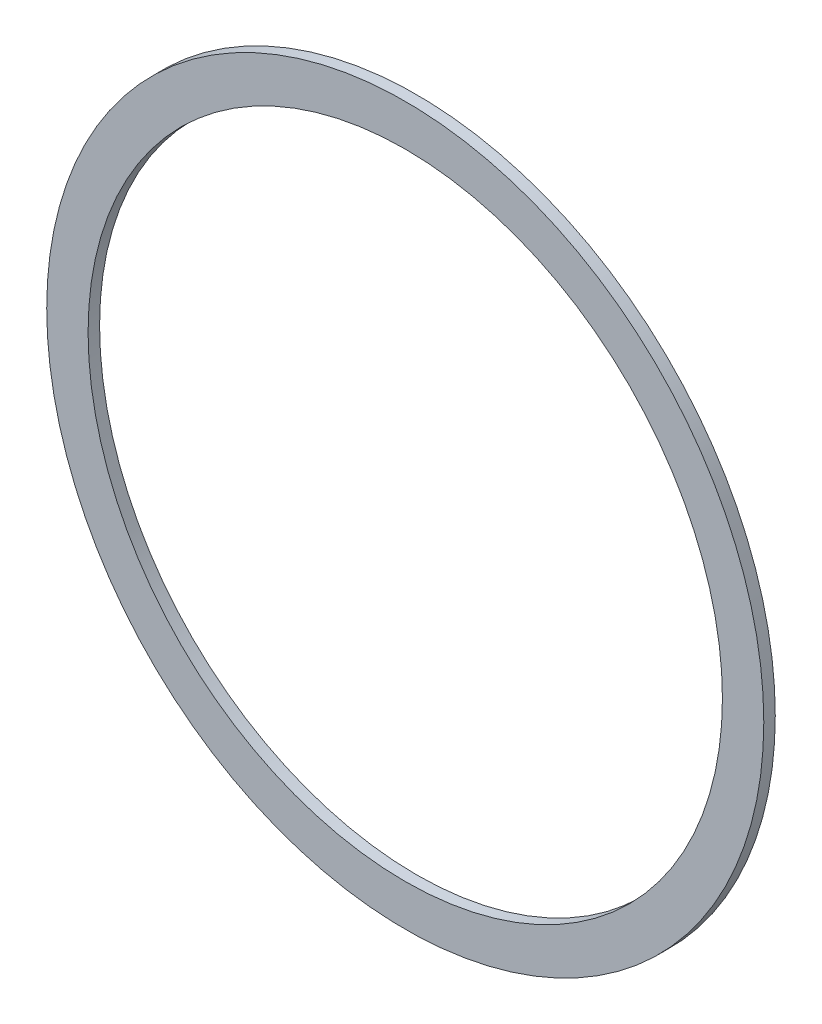
ISO-10303-21;
HEADER;
FILE_DESCRIPTION(('STEP AP214'),'2;1');
FILE_NAME('part.step','',(''),(''),'','','');
FILE_SCHEMA(('AUTOMOTIVE_DESIGN { 1 0 10303 214 1 1 1 1 }'));
ENDSEC;
DATA;
#1=APPLICATION_CONTEXT('core data for automotive mechanical design processes');
#2=APPLICATION_PROTOCOL_DEFINITION('international standard','automotive_design',2000,#1);
#3=PRODUCT_CONTEXT('',#1,'mechanical');
#4=PRODUCT('Part','Part','',(#3));
#5=PRODUCT_RELATED_PRODUCT_CATEGORY('part','',(#4));
#6=PRODUCT_DEFINITION_FORMATION('','',#4);
#7=PRODUCT_DEFINITION_CONTEXT('part definition',#1,'design');
#8=PRODUCT_DEFINITION('design','',#6,#7);
#9=PRODUCT_DEFINITION_SHAPE('','',#8);
#10=(LENGTH_UNIT() NAMED_UNIT(*) SI_UNIT(.MILLI.,.METRE.));
#11=(NAMED_UNIT(*) PLANE_ANGLE_UNIT() SI_UNIT($,.RADIAN.));
#12=(NAMED_UNIT(*) SI_UNIT($,.STERADIAN.) SOLID_ANGLE_UNIT());
#13=UNCERTAINTY_MEASURE_WITH_UNIT(LENGTH_MEASURE(1.E-05),#10,'distance_accuracy_value','');
#14=(GEOMETRIC_REPRESENTATION_CONTEXT(3) GLOBAL_UNCERTAINTY_ASSIGNED_CONTEXT((#13)) GLOBAL_UNIT_ASSIGNED_CONTEXT((#10,
#11,#12)) REPRESENTATION_CONTEXT('',''));
#15=CARTESIAN_POINT('',(0.,0.,0.));
#16=DIRECTION('',(0.,0.,1.));
#17=DIRECTION('',(1.,0.,0.));
#18=AXIS2_PLACEMENT_3D('',#15,#16,#17);
#19=CARTESIAN_POINT('',(0.,0.,0.5));
#20=DIRECTION('',(0.,0.,1.));
#21=DIRECTION('',(1.,0.,0.));
#22=AXIS2_PLACEMENT_3D('',#19,#20,#21);
#23=PLANE('',#22);
#24=CARTESIAN_POINT('',(0.,0.,0.5));
#25=DIRECTION('',(0.,0.,1.));
#26=DIRECTION('',(1.,0.,0.));
#27=AXIS2_PLACEMENT_3D('',#24,#25,#26);
#28=CIRCLE('',#27,15.6);
#29=CARTESIAN_POINT('',(15.6,0.,0.5));
#30=VERTEX_POINT('',#29);
#31=EDGE_CURVE('E11',#30,#30,#28,.T.);
#32=ORIENTED_EDGE('',*,*,#31,.T.);
#33=EDGE_LOOP('',(#32));
#34=FACE_BOUND('',#33,.T.);
#35=CARTESIAN_POINT('',(0.,0.,0.5));
#36=DIRECTION('',(0.,0.,1.));
#37=DIRECTION('',(1.,0.,0.));
#38=AXIS2_PLACEMENT_3D('',#35,#36,#37);
#39=CIRCLE('',#38,13.8);
#40=CARTESIAN_POINT('',(13.8,0.,0.5));
#41=VERTEX_POINT('',#40);
#42=EDGE_CURVE('E54',#41,#41,#39,.T.);
#43=ORIENTED_EDGE('',*,*,#42,.F.);
#44=EDGE_LOOP('',(#43));
#45=FACE_BOUND('',#44,.T.);
#46=ADVANCED_FACE('F43',(#34,#45),#23,.T.);
#47=CARTESIAN_POINT('',(0.,0.,0.));
#48=DIRECTION('',(0.,0.,1.));
#49=DIRECTION('',(1.,0.,0.));
#50=AXIS2_PLACEMENT_3D('',#47,#48,#49);
#51=PLANE('',#50);
#52=CARTESIAN_POINT('',(0.,0.,0.));
#53=DIRECTION('',(0.,0.,1.));
#54=DIRECTION('',(1.,0.,0.));
#55=AXIS2_PLACEMENT_3D('',#52,#53,#54);
#56=CIRCLE('',#55,15.6);
#57=CARTESIAN_POINT('',(15.6,0.,0.));
#58=VERTEX_POINT('',#57);
#59=EDGE_CURVE('E47',#58,#58,#56,.T.);
#60=ORIENTED_EDGE('',*,*,#59,.F.);
#61=EDGE_LOOP('',(#60));
#62=FACE_BOUND('',#61,.T.);
#63=CARTESIAN_POINT('',(0.,0.,0.));
#64=DIRECTION('',(0.,0.,1.));
#65=DIRECTION('',(1.,0.,0.));
#66=AXIS2_PLACEMENT_3D('',#63,#64,#65);
#67=CIRCLE('',#66,13.8);
#68=CARTESIAN_POINT('',(13.8,0.,0.));
#69=VERTEX_POINT('',#68);
#70=EDGE_CURVE('E56',#69,#69,#67,.T.);
#71=ORIENTED_EDGE('',*,*,#70,.T.);
#72=EDGE_LOOP('',(#71));
#73=FACE_BOUND('',#72,.T.);
#74=ADVANCED_FACE('F66',(#62,#73),#51,.F.);
#75=CARTESIAN_POINT('',(0.,0.,0.5));
#76=DIRECTION('',(0.,0.,-1.));
#77=DIRECTION('',(-1.,0.,0.));
#78=AXIS2_PLACEMENT_3D('',#75,#76,#77);
#79=CYLINDRICAL_SURFACE('',#78,15.6);
#80=ORIENTED_EDGE('',*,*,#31,.F.);
#81=EDGE_LOOP('',(#80));
#82=FACE_BOUND('',#81,.T.);
#83=ORIENTED_EDGE('',*,*,#59,.T.);
#84=EDGE_LOOP('',(#83));
#85=FACE_BOUND('',#84,.T.);
#86=ADVANCED_FACE('F45',(#82,#85),#79,.T.);
#87=CARTESIAN_POINT('',(0.,0.,0.5));
#88=DIRECTION('',(0.,0.,-1.));
#89=DIRECTION('',(-1.,0.,0.));
#90=AXIS2_PLACEMENT_3D('',#87,#88,#89);
#91=CYLINDRICAL_SURFACE('',#90,13.8);
#92=ORIENTED_EDGE('',*,*,#42,.T.);
#93=EDGE_LOOP('',(#92));
#94=FACE_BOUND('',#93,.T.);
#95=ORIENTED_EDGE('',*,*,#70,.F.);
#96=EDGE_LOOP('',(#95));
#97=FACE_BOUND('',#96,.T.);
#98=ADVANCED_FACE('F62',(#94,#97),#91,.F.);
#99=CLOSED_SHELL('',(#46,#74,#86,#98));
#100=MANIFOLD_SOLID_BREP('B2',#99);
#101=ADVANCED_BREP_SHAPE_REPRESENTATION('',(#18,#100),#14);
#102=SHAPE_DEFINITION_REPRESENTATION(#9,#101);
ENDSEC;
END-ISO-10303-21;
